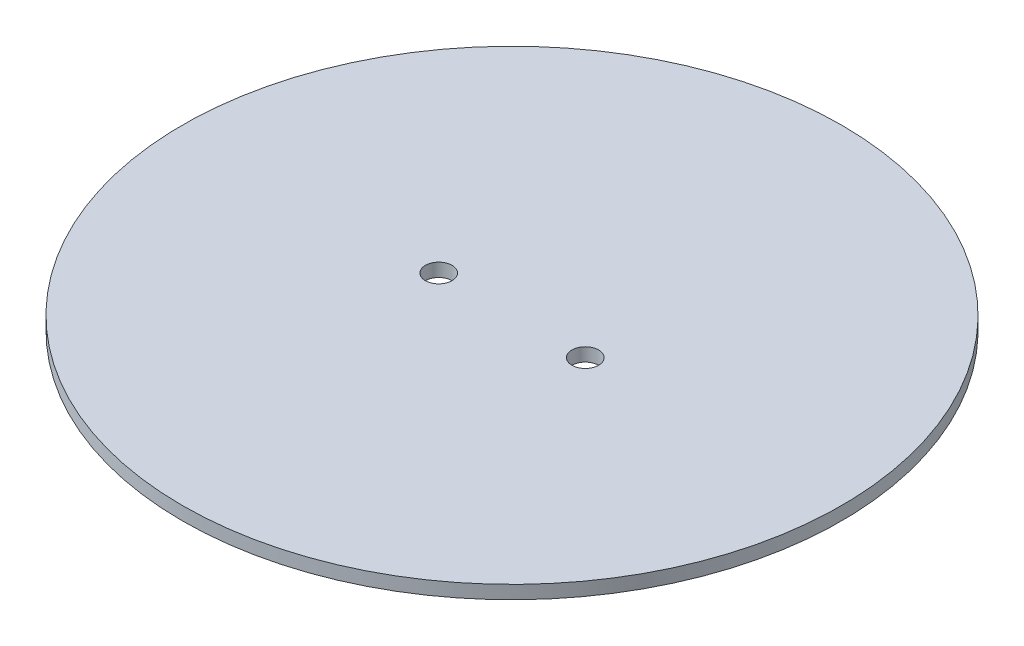
ISO-10303-21;
HEADER;
FILE_DESCRIPTION(('STEP AP214'),'2;1');
FILE_NAME('part.step','',(''),(''),'','','');
FILE_SCHEMA(('AUTOMOTIVE_DESIGN { 1 0 10303 214 1 1 1 1 }'));
ENDSEC;
DATA;
#1=APPLICATION_CONTEXT('core data for automotive mechanical design processes');
#2=APPLICATION_PROTOCOL_DEFINITION('international standard','automotive_design',2000,#1);
#3=PRODUCT_CONTEXT('',#1,'mechanical');
#4=PRODUCT('Part','Part','',(#3));
#5=PRODUCT_RELATED_PRODUCT_CATEGORY('part','',(#4));
#6=PRODUCT_DEFINITION_FORMATION('','',#4);
#7=PRODUCT_DEFINITION_CONTEXT('part definition',#1,'design');
#8=PRODUCT_DEFINITION('design','',#6,#7);
#9=PRODUCT_DEFINITION_SHAPE('','',#8);
#10=(LENGTH_UNIT() NAMED_UNIT(*) SI_UNIT(.MILLI.,.METRE.));
#11=(NAMED_UNIT(*) PLANE_ANGLE_UNIT() SI_UNIT($,.RADIAN.));
#12=(NAMED_UNIT(*) SI_UNIT($,.STERADIAN.) SOLID_ANGLE_UNIT());
#13=UNCERTAINTY_MEASURE_WITH_UNIT(LENGTH_MEASURE(1.E-05),#10,'distance_accuracy_value','');
#14=(GEOMETRIC_REPRESENTATION_CONTEXT(3) GLOBAL_UNCERTAINTY_ASSIGNED_CONTEXT((#13)) GLOBAL_UNIT_ASSIGNED_CONTEXT((#10,
#11,#12)) REPRESENTATION_CONTEXT('',''));
#15=CARTESIAN_POINT('',(0.,0.,0.));
#16=DIRECTION('',(0.,0.,1.));
#17=DIRECTION('',(1.,0.,0.));
#18=AXIS2_PLACEMENT_3D('',#15,#16,#17);
#19=CARTESIAN_POINT('',(0.,3.,0.));
#20=DIRECTION('',(0.,1.,0.));
#21=DIRECTION('',(0.,0.,1.));
#22=AXIS2_PLACEMENT_3D('',#19,#20,#21);
#23=PLANE('',#22);
#24=CARTESIAN_POINT('',(-16.5,3.,0.));
#25=DIRECTION('',(0.,1.,0.));
#26=DIRECTION('',(0.,0.,1.));
#27=AXIS2_PLACEMENT_3D('',#24,#25,#26);
#28=CIRCLE('',#27,3.);
#29=CARTESIAN_POINT('',(-16.5,3.,3.));
#30=VERTEX_POINT('',#29);
#31=EDGE_CURVE('E52',#30,#30,#28,.T.);
#32=ORIENTED_EDGE('',*,*,#31,.F.);
#33=EDGE_LOOP('',(#32));
#34=FACE_BOUND('',#33,.T.);
#35=CARTESIAN_POINT('',(0.,3.,0.));
#36=DIRECTION('',(0.,1.,0.));
#37=DIRECTION('',(0.,0.,1.));
#38=AXIS2_PLACEMENT_3D('',#35,#36,#37);
#39=CIRCLE('',#38,74.2);
#40=CARTESIAN_POINT('',(0.,3.,74.2));
#41=VERTEX_POINT('',#40);
#42=EDGE_CURVE('E10',#41,#41,#39,.T.);
#43=ORIENTED_EDGE('',*,*,#42,.T.);
#44=EDGE_LOOP('',(#43));
#45=FACE_BOUND('',#44,.T.);
#46=CARTESIAN_POINT('',(16.5,3.,0.));
#47=DIRECTION('',(0.,1.,0.));
#48=DIRECTION('',(0.,0.,1.));
#49=AXIS2_PLACEMENT_3D('',#46,#47,#48);
#50=CIRCLE('',#49,3.);
#51=CARTESIAN_POINT('',(16.5,3.,3.));
#52=VERTEX_POINT('',#51);
#53=EDGE_CURVE('E58',#52,#52,#50,.T.);
#54=ORIENTED_EDGE('',*,*,#53,.F.);
#55=EDGE_LOOP('',(#54));
#56=FACE_BOUND('',#55,.T.);
#57=ADVANCED_FACE('F39',(#34,#45,#56),#23,.T.);
#58=CARTESIAN_POINT('',(0.,0.,0.));
#59=DIRECTION('',(0.,1.,0.));
#60=DIRECTION('',(0.,0.,1.));
#61=AXIS2_PLACEMENT_3D('',#58,#59,#60);
#62=PLANE('',#61);
#63=CARTESIAN_POINT('',(0.,0.,0.));
#64=DIRECTION('',(0.,1.,0.));
#65=DIRECTION('',(0.,0.,1.));
#66=AXIS2_PLACEMENT_3D('',#63,#64,#65);
#67=CIRCLE('',#66,74.2);
#68=CARTESIAN_POINT('',(0.,0.,74.2));
#69=VERTEX_POINT('',#68);
#70=EDGE_CURVE('E43',#69,#69,#67,.T.);
#71=ORIENTED_EDGE('',*,*,#70,.F.);
#72=EDGE_LOOP('',(#71));
#73=FACE_BOUND('',#72,.T.);
#74=CARTESIAN_POINT('',(-16.5,0.,0.));
#75=DIRECTION('',(0.,1.,0.));
#76=DIRECTION('',(0.,0.,1.));
#77=AXIS2_PLACEMENT_3D('',#74,#75,#76);
#78=CIRCLE('',#77,3.);
#79=CARTESIAN_POINT('',(-16.5,0.,3.));
#80=VERTEX_POINT('',#79);
#81=EDGE_CURVE('E54',#80,#80,#78,.T.);
#82=ORIENTED_EDGE('',*,*,#81,.T.);
#83=EDGE_LOOP('',(#82));
#84=FACE_BOUND('',#83,.T.);
#85=CARTESIAN_POINT('',(16.5,0.,0.));
#86=DIRECTION('',(0.,1.,0.));
#87=DIRECTION('',(0.,0.,1.));
#88=AXIS2_PLACEMENT_3D('',#85,#86,#87);
#89=CIRCLE('',#88,3.);
#90=CARTESIAN_POINT('',(16.5,0.,3.));
#91=VERTEX_POINT('',#90);
#92=EDGE_CURVE('E62',#91,#91,#89,.T.);
#93=ORIENTED_EDGE('',*,*,#92,.T.);
#94=EDGE_LOOP('',(#93));
#95=FACE_BOUND('',#94,.T.);
#96=ADVANCED_FACE('F74',(#73,#84,#95),#62,.F.);
#97=CARTESIAN_POINT('',(0.,3.,0.));
#98=DIRECTION('',(0.,-1.,0.));
#99=DIRECTION('',(0.,0.,-1.));
#100=AXIS2_PLACEMENT_3D('',#97,#98,#99);
#101=CYLINDRICAL_SURFACE('',#100,74.2);
#102=ORIENTED_EDGE('',*,*,#42,.F.);
#103=EDGE_LOOP('',(#102));
#104=FACE_BOUND('',#103,.T.);
#105=ORIENTED_EDGE('',*,*,#70,.T.);
#106=EDGE_LOOP('',(#105));
#107=FACE_BOUND('',#106,.T.);
#108=ADVANCED_FACE('F41',(#104,#107),#101,.T.);
#109=CARTESIAN_POINT('',(-16.5,3.,0.));
#110=DIRECTION('',(0.,-1.,0.));
#111=DIRECTION('',(0.,0.,-1.));
#112=AXIS2_PLACEMENT_3D('',#109,#110,#111);
#113=CYLINDRICAL_SURFACE('',#112,3.);
#114=ORIENTED_EDGE('',*,*,#31,.T.);
#115=EDGE_LOOP('',(#114));
#116=FACE_BOUND('',#115,.T.);
#117=ORIENTED_EDGE('',*,*,#81,.F.);
#118=EDGE_LOOP('',(#117));
#119=FACE_BOUND('',#118,.T.);
#120=ADVANCED_FACE('F83',(#116,#119),#113,.F.);
#121=CARTESIAN_POINT('',(16.5,3.,0.));
#122=DIRECTION('',(0.,-1.,0.));
#123=DIRECTION('',(0.,0.,-1.));
#124=AXIS2_PLACEMENT_3D('',#121,#122,#123);
#125=CYLINDRICAL_SURFACE('',#124,3.);
#126=ORIENTED_EDGE('',*,*,#53,.T.);
#127=EDGE_LOOP('',(#126));
#128=FACE_BOUND('',#127,.T.);
#129=ORIENTED_EDGE('',*,*,#92,.F.);
#130=EDGE_LOOP('',(#129));
#131=FACE_BOUND('',#130,.T.);
#132=ADVANCED_FACE('F70',(#128,#131),#125,.F.);
#133=CLOSED_SHELL('',(#57,#96,#108,#120,#132));
#134=MANIFOLD_SOLID_BREP('B2',#133);
#135=ADVANCED_BREP_SHAPE_REPRESENTATION('',(#18,#134),#14);
#136=SHAPE_DEFINITION_REPRESENTATION(#9,#135);
ENDSEC;
END-ISO-10303-21;
